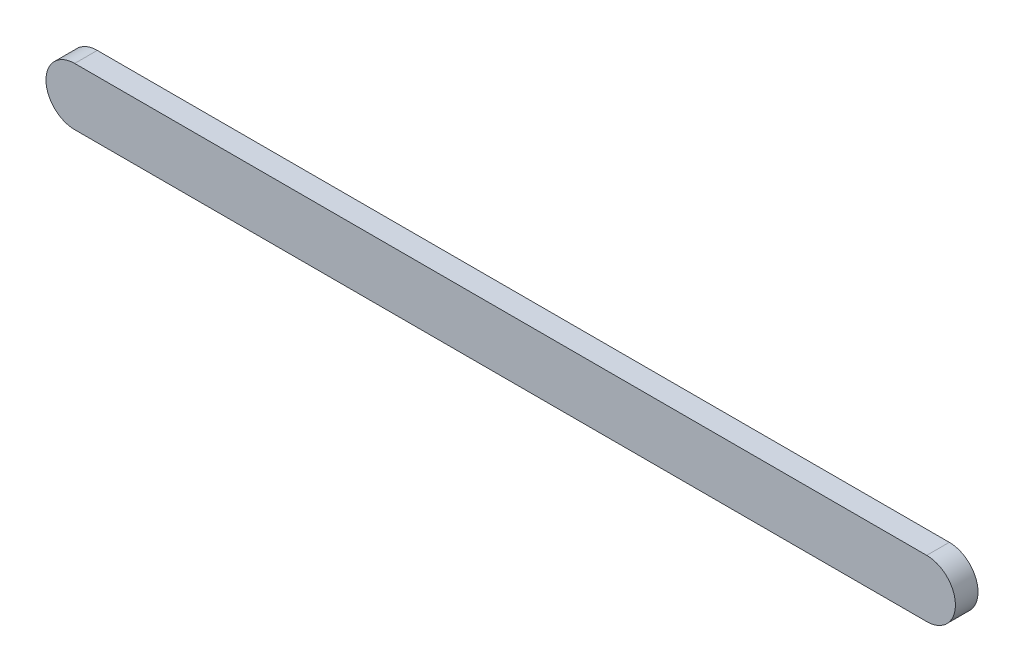
ISO-10303-21;
HEADER;
FILE_DESCRIPTION(('STEP AP214'),'2;1');
FILE_NAME('part.step','',(''),(''),'','','');
FILE_SCHEMA(('AUTOMOTIVE_DESIGN { 1 0 10303 214 1 1 1 1 }'));
ENDSEC;
DATA;
#1=APPLICATION_CONTEXT('core data for automotive mechanical design processes');
#2=APPLICATION_PROTOCOL_DEFINITION('international standard','automotive_design',2000,#1);
#3=PRODUCT_CONTEXT('',#1,'mechanical');
#4=PRODUCT('Part','Part','',(#3));
#5=PRODUCT_RELATED_PRODUCT_CATEGORY('part','',(#4));
#6=PRODUCT_DEFINITION_FORMATION('','',#4);
#7=PRODUCT_DEFINITION_CONTEXT('part definition',#1,'design');
#8=PRODUCT_DEFINITION('design','',#6,#7);
#9=PRODUCT_DEFINITION_SHAPE('','',#8);
#10=(LENGTH_UNIT() NAMED_UNIT(*) SI_UNIT(.MILLI.,.METRE.));
#11=(NAMED_UNIT(*) PLANE_ANGLE_UNIT() SI_UNIT($,.RADIAN.));
#12=(NAMED_UNIT(*) SI_UNIT($,.STERADIAN.) SOLID_ANGLE_UNIT());
#13=UNCERTAINTY_MEASURE_WITH_UNIT(LENGTH_MEASURE(1.E-05),#10,'distance_accuracy_value','');
#14=(GEOMETRIC_REPRESENTATION_CONTEXT(3) GLOBAL_UNCERTAINTY_ASSIGNED_CONTEXT((#13)) GLOBAL_UNIT_ASSIGNED_CONTEXT((#10,
#11,#12)) REPRESENTATION_CONTEXT('',''));
#15=CARTESIAN_POINT('',(0.,0.,0.));
#16=DIRECTION('',(0.,0.,1.));
#17=DIRECTION('',(1.,0.,0.));
#18=AXIS2_PLACEMENT_3D('',#15,#16,#17);
#19=CARTESIAN_POINT('',(134.8486,113.5634,0.));
#20=DIRECTION('',(0.,1.,0.));
#21=DIRECTION('',(1.,0.,0.));
#22=AXIS2_PLACEMENT_3D('',#19,#20,#21);
#23=PLANE('',#22);
#24=DIRECTION('',(1.,0.,0.));
#25=VECTOR('',#24,1.);
#26=CARTESIAN_POINT('',(134.8486,113.5634,0.1999996));
#27=LINE('',#26,#25);
#28=CARTESIAN_POINT('',(134.8486,113.5634,0.1999996));
#29=VERTEX_POINT('',#28);
#30=CARTESIAN_POINT('',(142.3924,113.5634,0.1999996));
#31=VERTEX_POINT('',#30);
#32=EDGE_CURVE('E11',#29,#31,#27,.T.);
#33=ORIENTED_EDGE('',*,*,#32,.F.);
#34=DIRECTION('',(0.,0.,1.));
#35=VECTOR('',#34,1.);
#36=CARTESIAN_POINT('',(134.8486,113.5634,0.));
#37=LINE('',#36,#35);
#38=CARTESIAN_POINT('',(134.8486,113.5634,0.));
#39=VERTEX_POINT('',#38);
#40=EDGE_CURVE('E24',#39,#29,#37,.T.);
#41=ORIENTED_EDGE('',*,*,#40,.F.);
#42=DIRECTION('',(1.,0.,0.));
#43=VECTOR('',#42,1.);
#44=CARTESIAN_POINT('',(134.8486,113.5634,0.));
#45=LINE('',#44,#43);
#46=CARTESIAN_POINT('',(142.3924,113.5634,0.));
#47=VERTEX_POINT('',#46);
#48=EDGE_CURVE('E75',#39,#47,#45,.T.);
#49=ORIENTED_EDGE('',*,*,#48,.T.);
#50=DIRECTION('',(0.,0.,1.));
#51=VECTOR('',#50,1.);
#52=CARTESIAN_POINT('',(142.3924,113.5634,0.));
#53=LINE('',#52,#51);
#54=EDGE_CURVE('E37',#47,#31,#53,.T.);
#55=ORIENTED_EDGE('',*,*,#54,.T.);
#56=EDGE_LOOP('',(#33,#41,#49,#55));
#57=FACE_BOUND('',#56,.T.);
#58=ADVANCED_FACE('F17',(#57),#23,.F.);
#59=CARTESIAN_POINT('',(142.3924,113.8174,0.));
#60=DIRECTION('',(0.,0.,-1.));
#61=DIRECTION('',(0.,-1.,0.));
#62=AXIS2_PLACEMENT_3D('',#59,#60,#61);
#63=CYLINDRICAL_SURFACE('',#62,0.253999999999995);
#64=CARTESIAN_POINT('',(142.3924,113.8174,0.1999996));
#65=DIRECTION('',(0.,0.,1.));
#66=DIRECTION('',(0.,-1.,0.));
#67=AXIS2_PLACEMENT_3D('',#64,#65,#66);
#68=CIRCLE('',#67,0.253999999999995);
#69=CARTESIAN_POINT('',(142.3924,114.0714,0.1999996));
#70=VERTEX_POINT('',#69);
#71=EDGE_CURVE('E83',#31,#70,#68,.T.);
#72=ORIENTED_EDGE('',*,*,#71,.F.);
#73=ORIENTED_EDGE('',*,*,#54,.F.);
#74=CARTESIAN_POINT('',(142.3924,113.8174,0.));
#75=DIRECTION('',(0.,0.,1.));
#76=DIRECTION('',(0.,-1.,0.));
#77=AXIS2_PLACEMENT_3D('',#74,#75,#76);
#78=CIRCLE('',#77,0.253999999999995);
#79=CARTESIAN_POINT('',(142.3924,114.0714,0.));
#80=VERTEX_POINT('',#79);
#81=EDGE_CURVE('E81',#47,#80,#78,.T.);
#82=ORIENTED_EDGE('',*,*,#81,.T.);
#83=DIRECTION('',(0.,0.,1.));
#84=VECTOR('',#83,1.);
#85=CARTESIAN_POINT('',(142.3924,114.0714,0.));
#86=LINE('',#85,#84);
#87=EDGE_CURVE('E67',#80,#70,#86,.T.);
#88=ORIENTED_EDGE('',*,*,#87,.T.);
#89=EDGE_LOOP('',(#72,#73,#82,#88));
#90=FACE_BOUND('',#89,.T.);
#91=ADVANCED_FACE('F89',(#90),#63,.T.);
#92=CARTESIAN_POINT('',(142.3924,114.0714,0.));
#93=DIRECTION('',(0.,-1.,0.));
#94=DIRECTION('',(-1.,0.,0.));
#95=AXIS2_PLACEMENT_3D('',#92,#93,#94);
#96=PLANE('',#95);
#97=DIRECTION('',(-1.,0.,0.));
#98=VECTOR('',#97,1.);
#99=CARTESIAN_POINT('',(142.3924,114.0714,0.1999996));
#100=LINE('',#99,#98);
#101=CARTESIAN_POINT('',(134.8486,114.0714,0.1999996));
#102=VERTEX_POINT('',#101);
#103=EDGE_CURVE('E71',#70,#102,#100,.T.);
#104=ORIENTED_EDGE('',*,*,#103,.F.);
#105=ORIENTED_EDGE('',*,*,#87,.F.);
#106=DIRECTION('',(-1.,0.,0.));
#107=VECTOR('',#106,1.);
#108=CARTESIAN_POINT('',(142.3924,114.0714,0.));
#109=LINE('',#108,#107);
#110=CARTESIAN_POINT('',(134.8486,114.0714,0.));
#111=VERTEX_POINT('',#110);
#112=EDGE_CURVE('E63',#80,#111,#109,.T.);
#113=ORIENTED_EDGE('',*,*,#112,.T.);
#114=DIRECTION('',(0.,0.,1.));
#115=VECTOR('',#114,1.);
#116=CARTESIAN_POINT('',(134.8486,114.0714,0.));
#117=LINE('',#116,#115);
#118=EDGE_CURVE('E53',#111,#102,#117,.T.);
#119=ORIENTED_EDGE('',*,*,#118,.T.);
#120=EDGE_LOOP('',(#104,#105,#113,#119));
#121=FACE_BOUND('',#120,.T.);
#122=ADVANCED_FACE('F66',(#121),#96,.F.);
#123=CARTESIAN_POINT('',(134.8486,113.8174,0.));
#124=DIRECTION('',(0.,0.,-1.));
#125=DIRECTION('',(-1.11896493820486E-13,1.,0.));
#126=AXIS2_PLACEMENT_3D('',#123,#124,#125);
#127=CYLINDRICAL_SURFACE('',#126,0.254000000000005);
#128=CARTESIAN_POINT('',(134.8486,113.8174,0.1999996));
#129=DIRECTION('',(0.,0.,1.));
#130=DIRECTION('',(-1.11896493820486E-13,1.,0.));
#131=AXIS2_PLACEMENT_3D('',#128,#129,#130);
#132=CIRCLE('',#131,0.254000000000005);
#133=EDGE_CURVE('E59',#102,#29,#132,.T.);
#134=ORIENTED_EDGE('',*,*,#133,.F.);
#135=ORIENTED_EDGE('',*,*,#118,.F.);
#136=CARTESIAN_POINT('',(134.8486,113.8174,0.));
#137=DIRECTION('',(0.,0.,1.));
#138=DIRECTION('',(-1.11896493820486E-13,1.,0.));
#139=AXIS2_PLACEMENT_3D('',#136,#137,#138);
#140=CIRCLE('',#139,0.254000000000005);
#141=EDGE_CURVE('E57',#111,#39,#140,.T.);
#142=ORIENTED_EDGE('',*,*,#141,.T.);
#143=ORIENTED_EDGE('',*,*,#40,.T.);
#144=EDGE_LOOP('',(#134,#135,#142,#143));
#145=FACE_BOUND('',#144,.T.);
#146=ADVANCED_FACE('F55',(#145),#127,.T.);
#147=CARTESIAN_POINT('',(134.8486,113.5634,0.));
#148=DIRECTION('',(0.,0.,-1.));
#149=DIRECTION('',(-1.,0.,0.));
#150=AXIS2_PLACEMENT_3D('',#147,#148,#149);
#151=PLANE('',#150);
#152=ORIENTED_EDGE('',*,*,#141,.F.);
#153=ORIENTED_EDGE('',*,*,#112,.F.);
#154=ORIENTED_EDGE('',*,*,#81,.F.);
#155=ORIENTED_EDGE('',*,*,#48,.F.);
#156=EDGE_LOOP('',(#152,#153,#154,#155));
#157=FACE_BOUND('',#156,.T.);
#158=ADVANCED_FACE('F74',(#157),#151,.T.);
#159=CARTESIAN_POINT('',(134.8486,113.5634,0.1999996));
#160=DIRECTION('',(0.,0.,-1.));
#161=DIRECTION('',(-1.,0.,0.));
#162=AXIS2_PLACEMENT_3D('',#159,#160,#161);
#163=PLANE('',#162);
#164=ORIENTED_EDGE('',*,*,#32,.T.);
#165=ORIENTED_EDGE('',*,*,#71,.T.);
#166=ORIENTED_EDGE('',*,*,#103,.T.);
#167=ORIENTED_EDGE('',*,*,#133,.T.);
#168=EDGE_LOOP('',(#164,#165,#166,#167));
#169=FACE_BOUND('',#168,.T.);
#170=ADVANCED_FACE('F91',(#169),#163,.F.);
#171=CLOSED_SHELL('',(#58,#91,#122,#146,#158,#170));
#172=MANIFOLD_SOLID_BREP('B1',#171);
#173=ADVANCED_BREP_SHAPE_REPRESENTATION('',(#18,#172),#14);
#174=SHAPE_DEFINITION_REPRESENTATION(#9,#173);
ENDSEC;
END-ISO-10303-21;
